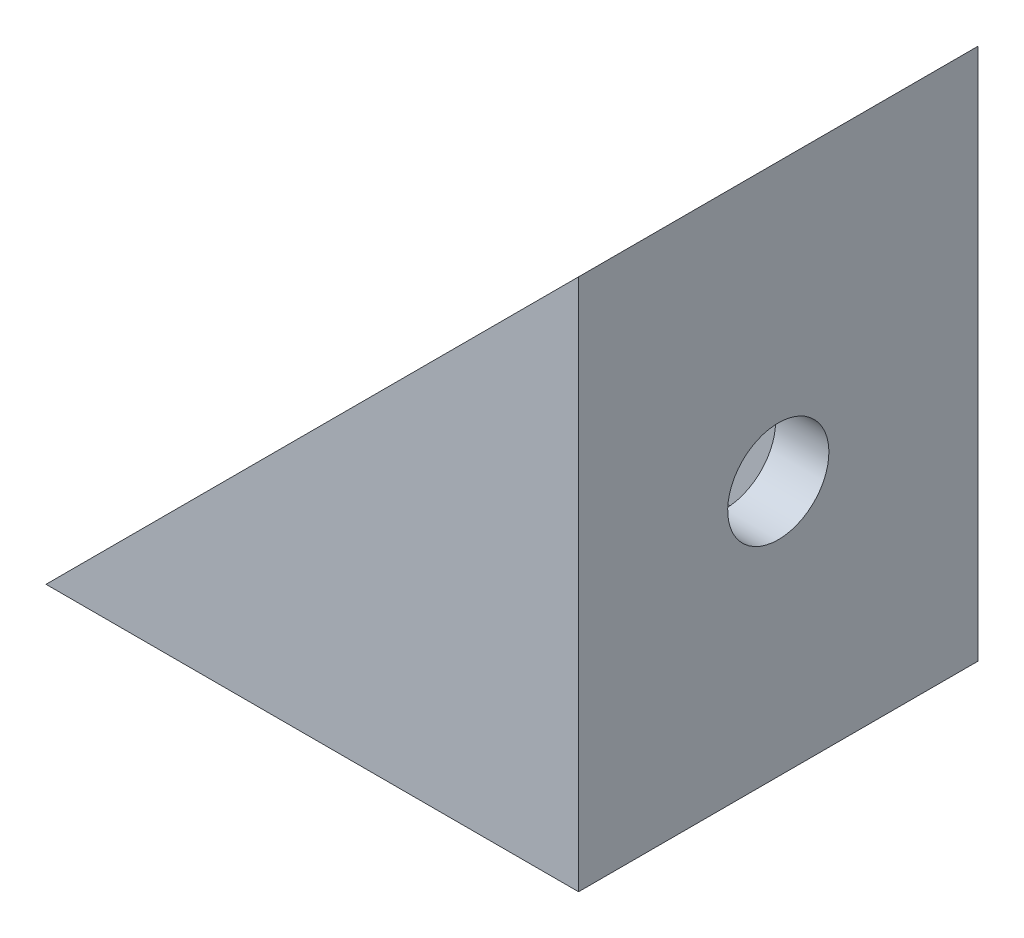
ISO-10303-21;
HEADER;
FILE_DESCRIPTION(('STEP AP214'),'2;1');
FILE_NAME('part.step','',(''),(''),'','','');
FILE_SCHEMA(('AUTOMOTIVE_DESIGN { 1 0 10303 214 1 1 1 1 }'));
ENDSEC;
DATA;
#1=APPLICATION_CONTEXT('core data for automotive mechanical design processes');
#2=APPLICATION_PROTOCOL_DEFINITION('international standard','automotive_design',2000,#1);
#3=PRODUCT_CONTEXT('',#1,'mechanical');
#4=PRODUCT('Part','Part','',(#3));
#5=PRODUCT_RELATED_PRODUCT_CATEGORY('part','',(#4));
#6=PRODUCT_DEFINITION_FORMATION('','',#4);
#7=PRODUCT_DEFINITION_CONTEXT('part definition',#1,'design');
#8=PRODUCT_DEFINITION('design','',#6,#7);
#9=PRODUCT_DEFINITION_SHAPE('','',#8);
#10=(LENGTH_UNIT() NAMED_UNIT(*) SI_UNIT(.MILLI.,.METRE.));
#11=(NAMED_UNIT(*) PLANE_ANGLE_UNIT() SI_UNIT($,.RADIAN.));
#12=(NAMED_UNIT(*) SI_UNIT($,.STERADIAN.) SOLID_ANGLE_UNIT());
#13=UNCERTAINTY_MEASURE_WITH_UNIT(LENGTH_MEASURE(1.E-05),#10,'distance_accuracy_value','');
#14=(GEOMETRIC_REPRESENTATION_CONTEXT(3) GLOBAL_UNCERTAINTY_ASSIGNED_CONTEXT((#13)) GLOBAL_UNIT_ASSIGNED_CONTEXT((#10,
#11,#12)) REPRESENTATION_CONTEXT('',''));
#15=CARTESIAN_POINT('',(0.,0.,0.));
#16=DIRECTION('',(0.,0.,1.));
#17=DIRECTION('',(1.,0.,0.));
#18=AXIS2_PLACEMENT_3D('',#15,#16,#17);
#19=CARTESIAN_POINT('',(-20.,0.,15.));
#20=DIRECTION('',(0.707106781186547,-0.707106781186547,0.));
#21=DIRECTION('',(0.707106781186548,0.707106781186548,0.));
#22=AXIS2_PLACEMENT_3D('',#19,#20,#21);
#23=PLANE('',#22);
#24=DIRECTION('',(-0.707106781186548,-0.707106781186548,0.));
#25=VECTOR('',#24,1.);
#26=CARTESIAN_POINT('',(-20.,0.,0.));
#27=LINE('',#26,#25);
#28=CARTESIAN_POINT('',(0.,20.,0.));
#29=VERTEX_POINT('',#28);
#30=CARTESIAN_POINT('',(-20.,0.,0.));
#31=VERTEX_POINT('',#30);
#32=EDGE_CURVE('E138',#29,#31,#27,.T.);
#33=ORIENTED_EDGE('',*,*,#32,.T.);
#34=DIRECTION('',(0.,0.,-1.));
#35=VECTOR('',#34,1.);
#36=CARTESIAN_POINT('',(-20.,0.,15.));
#37=LINE('',#36,#35);
#38=CARTESIAN_POINT('',(-20.,0.,15.));
#39=VERTEX_POINT('',#38);
#40=EDGE_CURVE('E41',#39,#31,#37,.T.);
#41=ORIENTED_EDGE('',*,*,#40,.F.);
#42=DIRECTION('',(-0.707106781186548,-0.707106781186548,0.));
#43=VECTOR('',#42,1.);
#44=CARTESIAN_POINT('',(-20.,0.,15.));
#45=LINE('',#44,#43);
#46=CARTESIAN_POINT('',(0.,20.,15.));
#47=VERTEX_POINT('',#46);
#48=EDGE_CURVE('E79',#47,#39,#45,.T.);
#49=ORIENTED_EDGE('',*,*,#48,.F.);
#50=DIRECTION('',(0.,0.,-1.));
#51=VECTOR('',#50,1.);
#52=CARTESIAN_POINT('',(0.,20.,15.));
#53=LINE('',#52,#51);
#54=EDGE_CURVE('E11',#47,#29,#53,.T.);
#55=ORIENTED_EDGE('',*,*,#54,.T.);
#56=EDGE_LOOP('',(#33,#41,#49,#55));
#57=FACE_BOUND('',#56,.T.);
#58=DIRECTION('',(-0.707106781186547,-0.707106781186548,0.));
#59=VECTOR('',#58,1.);
#60=CARTESIAN_POINT('',(-18.,2.,1.6));
#61=LINE('',#60,#59);
#62=CARTESIAN_POINT('',(-2.,18.,1.6));
#63=VERTEX_POINT('',#62);
#64=CARTESIAN_POINT('',(-18.,2.,1.6));
#65=VERTEX_POINT('',#64);
#66=EDGE_CURVE('E103',#63,#65,#61,.T.);
#67=ORIENTED_EDGE('',*,*,#66,.F.);
#68=DIRECTION('',(0.,0.,1.));
#69=VECTOR('',#68,1.);
#70=CARTESIAN_POINT('',(-2.,18.,1.6));
#71=LINE('',#70,#69);
#72=CARTESIAN_POINT('',(-2.,18.,13.4));
#73=VERTEX_POINT('',#72);
#74=EDGE_CURVE('E102',#63,#73,#71,.T.);
#75=ORIENTED_EDGE('',*,*,#74,.T.);
#76=DIRECTION('',(-0.707106781186547,-0.707106781186548,0.));
#77=VECTOR('',#76,1.);
#78=CARTESIAN_POINT('',(-18.,2.,13.4));
#79=LINE('',#78,#77);
#80=CARTESIAN_POINT('',(-18.,2.,13.4));
#81=VERTEX_POINT('',#80);
#82=EDGE_CURVE('E114',#73,#81,#79,.T.);
#83=ORIENTED_EDGE('',*,*,#82,.T.);
#84=DIRECTION('',(0.,0.,1.));
#85=VECTOR('',#84,1.);
#86=CARTESIAN_POINT('',(-18.,2.,1.6));
#87=LINE('',#86,#85);
#88=EDGE_CURVE('E127',#65,#81,#87,.T.);
#89=ORIENTED_EDGE('',*,*,#88,.F.);
#90=EDGE_LOOP('',(#67,#75,#83,#89));
#91=FACE_BOUND('',#90,.T.);
#92=ADVANCED_FACE('F33',(#57,#91),#23,.F.);
#93=CARTESIAN_POINT('',(0.,20.,15.));
#94=DIRECTION('',(-1.,0.,0.));
#95=DIRECTION('',(0.,-1.,0.));
#96=AXIS2_PLACEMENT_3D('',#93,#94,#95);
#97=PLANE('',#96);
#98=CARTESIAN_POINT('',(0.,9.6,7.5));
#99=DIRECTION('',(-1.,0.,0.));
#100=DIRECTION('',(0.,-1.,0.));
#101=AXIS2_PLACEMENT_3D('',#98,#99,#100);
#102=CIRCLE('',#101,1.9);
#103=CARTESIAN_POINT('',(0.,7.7,7.5));
#104=VERTEX_POINT('',#103);
#105=EDGE_CURVE('E125',#104,#104,#102,.T.);
#106=ORIENTED_EDGE('',*,*,#105,.T.);
#107=EDGE_LOOP('',(#106));
#108=FACE_BOUND('',#107,.T.);
#109=DIRECTION('',(0.,1.,0.));
#110=VECTOR('',#109,1.);
#111=CARTESIAN_POINT('',(0.,20.,0.));
#112=LINE('',#111,#110);
#113=CARTESIAN_POINT('',(0.,0.,0.));
#114=VERTEX_POINT('',#113);
#115=EDGE_CURVE('E129',#114,#29,#112,.T.);
#116=ORIENTED_EDGE('',*,*,#115,.T.);
#117=ORIENTED_EDGE('',*,*,#54,.F.);
#118=DIRECTION('',(0.,1.,0.));
#119=VECTOR('',#118,1.);
#120=CARTESIAN_POINT('',(0.,20.,15.));
#121=LINE('',#120,#119);
#122=CARTESIAN_POINT('',(0.,0.,15.));
#123=VERTEX_POINT('',#122);
#124=EDGE_CURVE('E131',#123,#47,#121,.T.);
#125=ORIENTED_EDGE('',*,*,#124,.F.);
#126=DIRECTION('',(0.,0.,-1.));
#127=VECTOR('',#126,1.);
#128=CARTESIAN_POINT('',(0.,0.,15.));
#129=LINE('',#128,#127);
#130=EDGE_CURVE('E135',#123,#114,#129,.T.);
#131=ORIENTED_EDGE('',*,*,#130,.T.);
#132=EDGE_LOOP('',(#116,#117,#125,#131));
#133=FACE_BOUND('',#132,.T.);
#134=ADVANCED_FACE('F35',(#108,#133),#97,.F.);
#135=CARTESIAN_POINT('',(0.,0.,15.));
#136=DIRECTION('',(0.,1.,0.));
#137=DIRECTION('',(0.,0.,1.));
#138=AXIS2_PLACEMENT_3D('',#135,#136,#137);
#139=PLANE('',#138);
#140=CARTESIAN_POINT('',(-9.6,0.,7.5));
#141=DIRECTION('',(0.,1.,0.));
#142=DIRECTION('',(-1.,0.,0.));
#143=AXIS2_PLACEMENT_3D('',#140,#141,#142);
#144=CIRCLE('',#143,1.9);
#145=CARTESIAN_POINT('',(-11.5,0.,7.5));
#146=VERTEX_POINT('',#145);
#147=EDGE_CURVE('E188',#146,#146,#144,.T.);
#148=ORIENTED_EDGE('',*,*,#147,.T.);
#149=EDGE_LOOP('',(#148));
#150=FACE_BOUND('',#149,.T.);
#151=DIRECTION('',(1.,0.,0.));
#152=VECTOR('',#151,1.);
#153=CARTESIAN_POINT('',(0.,0.,0.));
#154=LINE('',#153,#152);
#155=EDGE_CURVE('E74',#31,#114,#154,.T.);
#156=ORIENTED_EDGE('',*,*,#155,.T.);
#157=ORIENTED_EDGE('',*,*,#130,.F.);
#158=DIRECTION('',(1.,0.,0.));
#159=VECTOR('',#158,1.);
#160=CARTESIAN_POINT('',(0.,0.,15.));
#161=LINE('',#160,#159);
#162=EDGE_CURVE('E57',#39,#123,#161,.T.);
#163=ORIENTED_EDGE('',*,*,#162,.F.);
#164=ORIENTED_EDGE('',*,*,#40,.T.);
#165=EDGE_LOOP('',(#156,#157,#163,#164));
#166=FACE_BOUND('',#165,.T.);
#167=ADVANCED_FACE('F141',(#150,#166),#139,.F.);
#168=CARTESIAN_POINT('',(0.,0.,15.));
#169=DIRECTION('',(0.,0.,-1.));
#170=DIRECTION('',(-1.,0.,0.));
#171=AXIS2_PLACEMENT_3D('',#168,#169,#170);
#172=PLANE('',#171);
#173=ORIENTED_EDGE('',*,*,#124,.T.);
#174=ORIENTED_EDGE('',*,*,#48,.T.);
#175=ORIENTED_EDGE('',*,*,#162,.T.);
#176=EDGE_LOOP('',(#173,#174,#175));
#177=FACE_BOUND('',#176,.T.);
#178=ADVANCED_FACE('F148',(#177),#172,.F.);
#179=CARTESIAN_POINT('',(0.,0.,0.));
#180=DIRECTION('',(0.,0.,-1.));
#181=DIRECTION('',(-1.,0.,0.));
#182=AXIS2_PLACEMENT_3D('',#179,#180,#181);
#183=PLANE('',#182);
#184=ORIENTED_EDGE('',*,*,#115,.F.);
#185=ORIENTED_EDGE('',*,*,#155,.F.);
#186=ORIENTED_EDGE('',*,*,#32,.F.);
#187=EDGE_LOOP('',(#184,#185,#186));
#188=FACE_BOUND('',#187,.T.);
#189=ADVANCED_FACE('F144',(#188),#183,.T.);
#190=CARTESIAN_POINT('',(-2.,2.,1.6));
#191=DIRECTION('',(0.,-1.,0.));
#192=DIRECTION('',(1.,0.,0.));
#193=AXIS2_PLACEMENT_3D('',#190,#191,#192);
#194=PLANE('',#193);
#195=CARTESIAN_POINT('',(-9.6,2.,7.5));
#196=DIRECTION('',(0.,1.,0.));
#197=DIRECTION('',(-1.,0.,0.));
#198=AXIS2_PLACEMENT_3D('',#195,#196,#197);
#199=CIRCLE('',#198,1.9);
#200=CARTESIAN_POINT('',(-11.5,2.,7.5));
#201=VERTEX_POINT('',#200);
#202=EDGE_CURVE('E186',#201,#201,#199,.T.);
#203=ORIENTED_EDGE('',*,*,#202,.F.);
#204=EDGE_LOOP('',(#203));
#205=FACE_BOUND('',#204,.T.);
#206=DIRECTION('',(1.,0.,0.));
#207=VECTOR('',#206,1.);
#208=CARTESIAN_POINT('',(-2.,2.,13.4));
#209=LINE('',#208,#207);
#210=CARTESIAN_POINT('',(-2.,2.,13.4));
#211=VERTEX_POINT('',#210);
#212=EDGE_CURVE('E48',#81,#211,#209,.T.);
#213=ORIENTED_EDGE('',*,*,#212,.T.);
#214=DIRECTION('',(0.,0.,1.));
#215=VECTOR('',#214,1.);
#216=CARTESIAN_POINT('',(-2.,2.,1.6));
#217=LINE('',#216,#215);
#218=CARTESIAN_POINT('',(-2.,2.,1.6));
#219=VERTEX_POINT('',#218);
#220=EDGE_CURVE('E95',#219,#211,#217,.T.);
#221=ORIENTED_EDGE('',*,*,#220,.F.);
#222=DIRECTION('',(1.,0.,0.));
#223=VECTOR('',#222,1.);
#224=CARTESIAN_POINT('',(-2.,2.,1.6));
#225=LINE('',#224,#223);
#226=EDGE_CURVE('E99',#65,#219,#225,.T.);
#227=ORIENTED_EDGE('',*,*,#226,.F.);
#228=ORIENTED_EDGE('',*,*,#88,.T.);
#229=EDGE_LOOP('',(#213,#221,#227,#228));
#230=FACE_BOUND('',#229,.T.);
#231=ADVANCED_FACE('F97',(#205,#230),#194,.F.);
#232=CARTESIAN_POINT('',(-2.,18.,1.6));
#233=DIRECTION('',(1.,0.,0.));
#234=DIRECTION('',(0.,1.,0.));
#235=AXIS2_PLACEMENT_3D('',#232,#233,#234);
#236=PLANE('',#235);
#237=CARTESIAN_POINT('',(-2.,9.6,7.5));
#238=DIRECTION('',(-1.,0.,0.));
#239=DIRECTION('',(0.,-1.,0.));
#240=AXIS2_PLACEMENT_3D('',#237,#238,#239);
#241=CIRCLE('',#240,1.9);
#242=CARTESIAN_POINT('',(-2.,7.7,7.5));
#243=VERTEX_POINT('',#242);
#244=EDGE_CURVE('E120',#243,#243,#241,.T.);
#245=ORIENTED_EDGE('',*,*,#244,.F.);
#246=EDGE_LOOP('',(#245));
#247=FACE_BOUND('',#246,.T.);
#248=DIRECTION('',(0.,1.,0.));
#249=VECTOR('',#248,1.);
#250=CARTESIAN_POINT('',(-2.,18.,13.4));
#251=LINE('',#250,#249);
#252=EDGE_CURVE('E117',#211,#73,#251,.T.);
#253=ORIENTED_EDGE('',*,*,#252,.T.);
#254=ORIENTED_EDGE('',*,*,#74,.F.);
#255=DIRECTION('',(0.,1.,0.));
#256=VECTOR('',#255,1.);
#257=CARTESIAN_POINT('',(-2.,18.,1.6));
#258=LINE('',#257,#256);
#259=EDGE_CURVE('E106',#219,#63,#258,.T.);
#260=ORIENTED_EDGE('',*,*,#259,.F.);
#261=ORIENTED_EDGE('',*,*,#220,.T.);
#262=EDGE_LOOP('',(#253,#254,#260,#261));
#263=FACE_BOUND('',#262,.T.);
#264=ADVANCED_FACE('F107',(#247,#263),#236,.F.);
#265=CARTESIAN_POINT('',(0.,0.,1.6));
#266=DIRECTION('',(0.,0.,1.));
#267=DIRECTION('',(1.,0.,0.));
#268=AXIS2_PLACEMENT_3D('',#265,#266,#267);
#269=PLANE('',#268);
#270=ORIENTED_EDGE('',*,*,#226,.T.);
#271=ORIENTED_EDGE('',*,*,#259,.T.);
#272=ORIENTED_EDGE('',*,*,#66,.T.);
#273=EDGE_LOOP('',(#270,#271,#272));
#274=FACE_BOUND('',#273,.T.);
#275=ADVANCED_FACE('F112',(#274),#269,.T.);
#276=CARTESIAN_POINT('',(0.,0.,13.4));
#277=DIRECTION('',(0.,0.,1.));
#278=DIRECTION('',(1.,0.,0.));
#279=AXIS2_PLACEMENT_3D('',#276,#277,#278);
#280=PLANE('',#279);
#281=ORIENTED_EDGE('',*,*,#212,.F.);
#282=ORIENTED_EDGE('',*,*,#82,.F.);
#283=ORIENTED_EDGE('',*,*,#252,.F.);
#284=EDGE_LOOP('',(#281,#282,#283));
#285=FACE_BOUND('',#284,.T.);
#286=ADVANCED_FACE('F165',(#285),#280,.F.);
#287=CARTESIAN_POINT('',(0.,9.6,7.5));
#288=DIRECTION('',(-1.,0.,0.));
#289=DIRECTION('',(0.,-1.,0.));
#290=AXIS2_PLACEMENT_3D('',#287,#288,#289);
#291=CYLINDRICAL_SURFACE('',#290,1.9);
#292=ORIENTED_EDGE('',*,*,#105,.F.);
#293=EDGE_LOOP('',(#292));
#294=FACE_BOUND('',#293,.T.);
#295=ORIENTED_EDGE('',*,*,#244,.T.);
#296=EDGE_LOOP('',(#295));
#297=FACE_BOUND('',#296,.T.);
#298=ADVANCED_FACE('F167',(#294,#297),#291,.F.);
#299=CARTESIAN_POINT('',(-9.6,0.,7.5));
#300=DIRECTION('',(0.,1.,0.));
#301=DIRECTION('',(-1.,0.,0.));
#302=AXIS2_PLACEMENT_3D('',#299,#300,#301);
#303=CYLINDRICAL_SURFACE('',#302,1.9);
#304=ORIENTED_EDGE('',*,*,#147,.F.);
#305=EDGE_LOOP('',(#304));
#306=FACE_BOUND('',#305,.T.);
#307=ORIENTED_EDGE('',*,*,#202,.T.);
#308=EDGE_LOOP('',(#307));
#309=FACE_BOUND('',#308,.T.);
#310=ADVANCED_FACE('F173',(#306,#309),#303,.F.);
#311=CLOSED_SHELL('',(#92,#134,#167,#178,#189,#231,#264,#275,#286,#298,#310));
#312=MANIFOLD_SOLID_BREP('B2',#311);
#313=ADVANCED_BREP_SHAPE_REPRESENTATION('',(#18,#312),#14);
#314=SHAPE_DEFINITION_REPRESENTATION(#9,#313);
ENDSEC;
END-ISO-10303-21;
